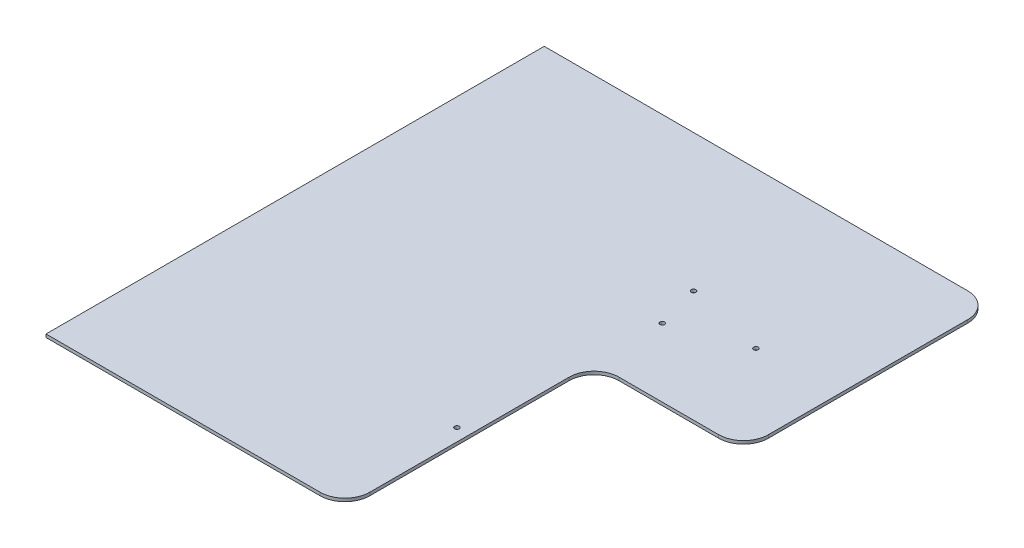
ISO-10303-21;
HEADER;
FILE_DESCRIPTION(('STEP AP214'),'2;1');
FILE_NAME('part.step','',(''),(''),'','','');
FILE_SCHEMA(('AUTOMOTIVE_DESIGN { 1 0 10303 214 1 1 1 1 }'));
ENDSEC;
DATA;
#1=APPLICATION_CONTEXT('core data for automotive mechanical design processes');
#2=APPLICATION_PROTOCOL_DEFINITION('international standard','automotive_design',2000,#1);
#3=PRODUCT_CONTEXT('',#1,'mechanical');
#4=PRODUCT('Part','Part','',(#3));
#5=PRODUCT_RELATED_PRODUCT_CATEGORY('part','',(#4));
#6=PRODUCT_DEFINITION_FORMATION('','',#4);
#7=PRODUCT_DEFINITION_CONTEXT('part definition',#1,'design');
#8=PRODUCT_DEFINITION('design','',#6,#7);
#9=PRODUCT_DEFINITION_SHAPE('','',#8);
#10=(LENGTH_UNIT() NAMED_UNIT(*) SI_UNIT(.MILLI.,.METRE.));
#11=(NAMED_UNIT(*) PLANE_ANGLE_UNIT() SI_UNIT($,.RADIAN.));
#12=(NAMED_UNIT(*) SI_UNIT($,.STERADIAN.) SOLID_ANGLE_UNIT());
#13=UNCERTAINTY_MEASURE_WITH_UNIT(LENGTH_MEASURE(1.E-05),#10,'distance_accuracy_value','');
#14=(GEOMETRIC_REPRESENTATION_CONTEXT(3) GLOBAL_UNCERTAINTY_ASSIGNED_CONTEXT((#13)) GLOBAL_UNIT_ASSIGNED_CONTEXT((#10,
#11,#12)) REPRESENTATION_CONTEXT('',''));
#15=CARTESIAN_POINT('',(0.,0.,0.));
#16=DIRECTION('',(0.,0.,1.));
#17=DIRECTION('',(1.,0.,0.));
#18=AXIS2_PLACEMENT_3D('',#15,#16,#17);
#19=CARTESIAN_POINT('',(152.4,3.175,254.));
#20=DIRECTION('',(-1.,0.,0.));
#21=DIRECTION('',(0.,0.,1.));
#22=AXIS2_PLACEMENT_3D('',#19,#20,#21);
#23=PLANE('',#22);
#24=DIRECTION('',(0.,0.,-1.));
#25=VECTOR('',#24,1.);
#26=CARTESIAN_POINT('',(152.4,3.175,254.));
#27=LINE('',#26,#25);
#28=CARTESIAN_POINT('',(152.4,3.175,228.6));
#29=VERTEX_POINT('',#28);
#30=CARTESIAN_POINT('',(152.4,3.175,25.4));
#31=VERTEX_POINT('',#30);
#32=EDGE_CURVE('E165',#29,#31,#27,.T.);
#33=ORIENTED_EDGE('',*,*,#32,.F.);
#34=DIRECTION('',(0.,-1.,0.));
#35=VECTOR('',#34,1.);
#36=CARTESIAN_POINT('',(152.4,3.175,228.6));
#37=LINE('',#36,#35);
#38=CARTESIAN_POINT('',(152.4,0.,228.6));
#39=VERTEX_POINT('',#38);
#40=EDGE_CURVE('E172',#29,#39,#37,.T.);
#41=ORIENTED_EDGE('',*,*,#40,.T.);
#42=DIRECTION('',(0.,0.,-1.));
#43=VECTOR('',#42,1.);
#44=CARTESIAN_POINT('',(152.4,0.,254.));
#45=LINE('',#44,#43);
#46=CARTESIAN_POINT('',(152.4,0.,25.4));
#47=VERTEX_POINT('',#46);
#48=EDGE_CURVE('E134',#39,#47,#45,.T.);
#49=ORIENTED_EDGE('',*,*,#48,.T.);
#50=DIRECTION('',(0.,-1.,0.));
#51=VECTOR('',#50,1.);
#52=CARTESIAN_POINT('',(152.4,3.175,25.4));
#53=LINE('',#52,#51);
#54=EDGE_CURVE('E289',#47,#31,#53,.F.);
#55=ORIENTED_EDGE('',*,*,#54,.T.);
#56=EDGE_LOOP('',(#33,#41,#49,#55));
#57=FACE_BOUND('',#56,.T.);
#58=ADVANCED_FACE('F33',(#57),#23,.F.);
#59=CARTESIAN_POINT('',(-152.4,3.175,-254.));
#60=DIRECTION('',(0.,0.,1.));
#61=DIRECTION('',(1.,0.,0.));
#62=AXIS2_PLACEMENT_3D('',#59,#60,#61);
#63=PLANE('',#62);
#64=DIRECTION('',(-1.,0.,0.));
#65=VECTOR('',#64,1.);
#66=CARTESIAN_POINT('',(-152.4,0.,-254.));
#67=LINE('',#66,#65);
#68=CARTESIAN_POINT('',(152.4,0.,-254.));
#69=VERTEX_POINT('',#68);
#70=CARTESIAN_POINT('',(-152.4,0.,-254.));
#71=VERTEX_POINT('',#70);
#72=EDGE_CURVE('E141',#69,#71,#67,.T.);
#73=ORIENTED_EDGE('',*,*,#72,.T.);
#74=DIRECTION('',(0.,-1.,0.));
#75=VECTOR('',#74,1.);
#76=CARTESIAN_POINT('',(-152.4,3.175,-254.));
#77=LINE('',#76,#75);
#78=CARTESIAN_POINT('',(-152.4,3.175,-254.));
#79=VERTEX_POINT('',#78);
#80=EDGE_CURVE('E467',#79,#71,#77,.T.);
#81=ORIENTED_EDGE('',*,*,#80,.F.);
#82=DIRECTION('',(-1.,0.,0.));
#83=VECTOR('',#82,1.);
#84=CARTESIAN_POINT('',(-152.4,3.175,-254.));
#85=LINE('',#84,#83);
#86=CARTESIAN_POINT('',(152.4,3.175,-254.));
#87=VERTEX_POINT('',#86);
#88=EDGE_CURVE('E168',#87,#79,#85,.T.);
#89=ORIENTED_EDGE('',*,*,#88,.F.);
#90=DIRECTION('',(0.,-1.,0.));
#91=VECTOR('',#90,1.);
#92=CARTESIAN_POINT('',(152.4,3.175,-254.));
#93=LINE('',#92,#91);
#94=EDGE_CURVE('E283',#87,#69,#93,.T.);
#95=ORIENTED_EDGE('',*,*,#94,.T.);
#96=EDGE_LOOP('',(#73,#81,#89,#95));
#97=FACE_BOUND('',#96,.T.);
#98=ADVANCED_FACE('F319',(#97),#63,.F.);
#99=CARTESIAN_POINT('',(-152.4,3.175,254.));
#100=DIRECTION('',(1.,0.,0.));
#101=DIRECTION('',(0.,0.,-1.));
#102=AXIS2_PLACEMENT_3D('',#99,#100,#101);
#103=PLANE('',#102);
#104=DIRECTION('',(0.,0.,1.));
#105=VECTOR('',#104,1.);
#106=CARTESIAN_POINT('',(-152.4,0.,254.));
#107=LINE('',#106,#105);
#108=CARTESIAN_POINT('',(-152.4,0.,254.));
#109=VERTEX_POINT('',#108);
#110=EDGE_CURVE('E275',#71,#109,#107,.T.);
#111=ORIENTED_EDGE('',*,*,#110,.T.);
#112=DIRECTION('',(0.,-1.,0.));
#113=VECTOR('',#112,1.);
#114=CARTESIAN_POINT('',(-152.4,3.175,254.));
#115=LINE('',#114,#113);
#116=CARTESIAN_POINT('',(-152.4,3.175,254.));
#117=VERTEX_POINT('',#116);
#118=EDGE_CURVE('E268',#117,#109,#115,.T.);
#119=ORIENTED_EDGE('',*,*,#118,.F.);
#120=DIRECTION('',(0.,0.,1.));
#121=VECTOR('',#120,1.);
#122=CARTESIAN_POINT('',(-152.4,3.175,254.));
#123=LINE('',#122,#121);
#124=EDGE_CURVE('E162',#79,#117,#123,.T.);
#125=ORIENTED_EDGE('',*,*,#124,.F.);
#126=ORIENTED_EDGE('',*,*,#80,.T.);
#127=EDGE_LOOP('',(#111,#119,#125,#126));
#128=FACE_BOUND('',#127,.T.);
#129=ADVANCED_FACE('F323',(#128),#103,.F.);
#130=CARTESIAN_POINT('',(-152.4,3.175,254.));
#131=DIRECTION('',(0.,0.,-1.));
#132=DIRECTION('',(-1.,0.,0.));
#133=AXIS2_PLACEMENT_3D('',#130,#131,#132);
#134=PLANE('',#133);
#135=DIRECTION('',(1.,0.,0.));
#136=VECTOR('',#135,1.);
#137=CARTESIAN_POINT('',(-152.4,0.,254.));
#138=LINE('',#137,#136);
#139=CARTESIAN_POINT('',(127.,0.,254.));
#140=VERTEX_POINT('',#139);
#141=EDGE_CURVE('E169',#109,#140,#138,.T.);
#142=ORIENTED_EDGE('',*,*,#141,.T.);
#143=DIRECTION('',(0.,-1.,0.));
#144=VECTOR('',#143,1.);
#145=CARTESIAN_POINT('',(127.,3.175,254.));
#146=LINE('',#145,#144);
#147=CARTESIAN_POINT('',(127.,3.175,254.));
#148=VERTEX_POINT('',#147);
#149=EDGE_CURVE('E42',#140,#148,#146,.F.);
#150=ORIENTED_EDGE('',*,*,#149,.T.);
#151=DIRECTION('',(1.,0.,0.));
#152=VECTOR('',#151,1.);
#153=CARTESIAN_POINT('',(-152.4,3.175,254.));
#154=LINE('',#153,#152);
#155=EDGE_CURVE('E262',#117,#148,#154,.T.);
#156=ORIENTED_EDGE('',*,*,#155,.F.);
#157=ORIENTED_EDGE('',*,*,#118,.T.);
#158=EDGE_LOOP('',(#142,#150,#156,#157));
#159=FACE_BOUND('',#158,.T.);
#160=ADVANCED_FACE('F259',(#159),#134,.F.);
#161=CARTESIAN_POINT('',(0.,3.175,0.));
#162=DIRECTION('',(0.,-1.,0.));
#163=DIRECTION('',(0.,0.,-1.));
#164=AXIS2_PLACEMENT_3D('',#161,#162,#163);
#165=PLANE('',#164);
#166=CARTESIAN_POINT('',(222.25,3.175,-95.0775526563993));
#167=DIRECTION('',(0.,1.,0.));
#168=DIRECTION('',(0.,0.,1.));
#169=AXIS2_PLACEMENT_3D('',#166,#167,#168);
#170=CIRCLE('',#169,2.38125);
#171=CARTESIAN_POINT('',(222.25,3.175,-92.6963026563993));
#172=VERTEX_POINT('',#171);
#173=EDGE_CURVE('E191',#172,#172,#170,.T.);
#174=ORIENTED_EDGE('',*,*,#173,.F.);
#175=EDGE_LOOP('',(#174));
#176=FACE_BOUND('',#175,.T.);
#177=CARTESIAN_POINT('',(152.4,3.175,-69.6775526563993));
#178=DIRECTION('',(0.,1.,0.));
#179=DIRECTION('',(0.,0.,1.));
#180=AXIS2_PLACEMENT_3D('',#177,#178,#179);
#181=CIRCLE('',#180,2.38125);
#182=CARTESIAN_POINT('',(152.4,3.175,-67.2963026563993));
#183=VERTEX_POINT('',#182);
#184=EDGE_CURVE('E180',#183,#183,#181,.T.);
#185=ORIENTED_EDGE('',*,*,#184,.F.);
#186=EDGE_LOOP('',(#185));
#187=FACE_BOUND('',#186,.T.);
#188=CARTESIAN_POINT('',(139.7,3.175,-114.127552656399));
#189=DIRECTION('',(0.,1.,0.));
#190=DIRECTION('',(0.,0.,1.));
#191=AXIS2_PLACEMENT_3D('',#188,#189,#190);
#192=CIRCLE('',#191,2.38125);
#193=CARTESIAN_POINT('',(139.7,3.17500000000001,-111.746302656399));
#194=VERTEX_POINT('',#193);
#195=EDGE_CURVE('E179',#194,#194,#192,.T.);
#196=ORIENTED_EDGE('',*,*,#195,.F.);
#197=EDGE_LOOP('',(#196));
#198=FACE_BOUND('',#197,.T.);
#199=CARTESIAN_POINT('',(139.7,3.175,127.172447343601));
#200=DIRECTION('',(0.,1.,0.));
#201=DIRECTION('',(0.,0.,1.));
#202=AXIS2_PLACEMENT_3D('',#199,#200,#201);
#203=CIRCLE('',#202,2.38124999999995);
#204=CARTESIAN_POINT('',(139.7,3.17500000000001,129.553697343601));
#205=VERTEX_POINT('',#204);
#206=EDGE_CURVE('E194',#205,#205,#203,.T.);
#207=ORIENTED_EDGE('',*,*,#206,.F.);
#208=EDGE_LOOP('',(#207));
#209=FACE_BOUND('',#208,.T.);
#210=ORIENTED_EDGE('',*,*,#155,.T.);
#211=CARTESIAN_POINT('',(127.,3.175,228.6));
#212=DIRECTION('',(0.,-1.,0.));
#213=DIRECTION('',(0.,0.,-1.));
#214=AXIS2_PLACEMENT_3D('',#211,#212,#213);
#215=CIRCLE('',#214,25.4);
#216=EDGE_CURVE('E11',#148,#29,#215,.F.);
#217=ORIENTED_EDGE('',*,*,#216,.T.);
#218=ORIENTED_EDGE('',*,*,#32,.T.);
#219=CARTESIAN_POINT('',(177.8,3.175,25.4));
#220=DIRECTION('',(0.,-1.,0.));
#221=DIRECTION('',(0.,0.,-1.));
#222=AXIS2_PLACEMENT_3D('',#219,#220,#221);
#223=CIRCLE('',#222,25.4);
#224=CARTESIAN_POINT('',(177.8,3.175,0.));
#225=VERTEX_POINT('',#224);
#226=EDGE_CURVE('E292',#31,#225,#223,.T.);
#227=ORIENTED_EDGE('',*,*,#226,.T.);
#228=DIRECTION('',(-1.,0.,0.));
#229=VECTOR('',#228,1.);
#230=CARTESIAN_POINT('',(304.8,3.175,0.));
#231=LINE('',#230,#229);
#232=CARTESIAN_POINT('',(279.4,3.175,0.));
#233=VERTEX_POINT('',#232);
#234=EDGE_CURVE('E206',#233,#225,#231,.T.);
#235=ORIENTED_EDGE('',*,*,#234,.F.);
#236=CARTESIAN_POINT('',(279.4,3.175,-25.4));
#237=DIRECTION('',(0.,-1.,0.));
#238=DIRECTION('',(0.,0.,-1.));
#239=AXIS2_PLACEMENT_3D('',#236,#237,#238);
#240=CIRCLE('',#239,25.4);
#241=CARTESIAN_POINT('',(304.8,3.175,-25.4));
#242=VERTEX_POINT('',#241);
#243=EDGE_CURVE('E230',#233,#242,#240,.F.);
#244=ORIENTED_EDGE('',*,*,#243,.T.);
#245=DIRECTION('',(0.,0.,1.));
#246=VECTOR('',#245,1.);
#247=CARTESIAN_POINT('',(304.8,3.175,0.));
#248=LINE('',#247,#246);
#249=CARTESIAN_POINT('',(304.8,3.175,-228.603143871149));
#250=VERTEX_POINT('',#249);
#251=EDGE_CURVE('E198',#250,#242,#248,.T.);
#252=ORIENTED_EDGE('',*,*,#251,.F.);
#253=CARTESIAN_POINT('',(279.4,3.175,-228.603143871149));
#254=DIRECTION('',(0.,-1.,0.));
#255=DIRECTION('',(0.,0.,-1.));
#256=AXIS2_PLACEMENT_3D('',#253,#254,#255);
#257=CIRCLE('',#256,25.4);
#258=CARTESIAN_POINT('',(279.4,3.175,-254.003143871149));
#259=VERTEX_POINT('',#258);
#260=EDGE_CURVE('E231',#250,#259,#257,.F.);
#261=ORIENTED_EDGE('',*,*,#260,.T.);
#262=DIRECTION('',(-1.,0.,0.));
#263=VECTOR('',#262,1.);
#264=CARTESIAN_POINT('',(304.8,3.175,-254.003143871149));
#265=LINE('',#264,#263);
#266=CARTESIAN_POINT('',(152.4,3.175,-254.003143871149));
#267=VERTEX_POINT('',#266);
#268=EDGE_CURVE('E135',#259,#267,#265,.T.);
#269=ORIENTED_EDGE('',*,*,#268,.T.);
#270=DIRECTION('',(0.,0.,1.));
#271=VECTOR('',#270,1.);
#272=CARTESIAN_POINT('',(152.4,3.175,0.));
#273=LINE('',#272,#271);
#274=EDGE_CURVE('E149',#267,#87,#273,.T.);
#275=ORIENTED_EDGE('',*,*,#274,.T.);
#276=ORIENTED_EDGE('',*,*,#88,.T.);
#277=ORIENTED_EDGE('',*,*,#124,.T.);
#278=EDGE_LOOP('',(#210,#217,#218,#227,#235,#244,#252,#261,#269,#275,#276,#277));
#279=FACE_BOUND('',#278,.T.);
#280=ADVANCED_FACE('F246',(#176,#187,#198,#209,#279),#165,.F.);
#281=CARTESIAN_POINT('',(0.,0.,0.));
#282=DIRECTION('',(0.,-1.,0.));
#283=DIRECTION('',(0.,0.,-1.));
#284=AXIS2_PLACEMENT_3D('',#281,#282,#283);
#285=PLANE('',#284);
#286=CARTESIAN_POINT('',(222.25,0.,-95.0775526563993));
#287=DIRECTION('',(0.,-1.,0.));
#288=DIRECTION('',(0.,0.,-1.));
#289=AXIS2_PLACEMENT_3D('',#286,#287,#288);
#290=CIRCLE('',#289,2.38125);
#291=CARTESIAN_POINT('',(222.25,0.,-97.4588026563993));
#292=VERTEX_POINT('',#291);
#293=EDGE_CURVE('E37',#292,#292,#290,.T.);
#294=ORIENTED_EDGE('',*,*,#293,.F.);
#295=EDGE_LOOP('',(#294));
#296=FACE_BOUND('',#295,.T.);
#297=CARTESIAN_POINT('',(152.4,0.,-69.6775526563993));
#298=DIRECTION('',(0.,-1.,0.));
#299=DIRECTION('',(0.,0.,-1.));
#300=AXIS2_PLACEMENT_3D('',#297,#298,#299);
#301=CIRCLE('',#300,2.38125);
#302=CARTESIAN_POINT('',(152.4,0.,-72.0588026563993));
#303=VERTEX_POINT('',#302);
#304=EDGE_CURVE('E177',#303,#303,#301,.T.);
#305=ORIENTED_EDGE('',*,*,#304,.F.);
#306=EDGE_LOOP('',(#305));
#307=FACE_BOUND('',#306,.T.);
#308=CARTESIAN_POINT('',(139.7,0.,-114.127552656399));
#309=DIRECTION('',(0.,-1.,0.));
#310=DIRECTION('',(0.,0.,-1.));
#311=AXIS2_PLACEMENT_3D('',#308,#309,#310);
#312=CIRCLE('',#311,2.38125);
#313=CARTESIAN_POINT('',(139.7,0.,-111.746302656399));
#314=VERTEX_POINT('',#313);
#315=EDGE_CURVE('E184',#314,#314,#312,.T.);
#316=ORIENTED_EDGE('',*,*,#315,.F.);
#317=EDGE_LOOP('',(#316));
#318=FACE_BOUND('',#317,.T.);
#319=CARTESIAN_POINT('',(139.7,0.,127.172447343601));
#320=DIRECTION('',(0.,-1.,0.));
#321=DIRECTION('',(0.,0.,-1.));
#322=AXIS2_PLACEMENT_3D('',#319,#320,#321);
#323=CIRCLE('',#322,2.38124999999995);
#324=CARTESIAN_POINT('',(139.7,0.,129.553697343601));
#325=VERTEX_POINT('',#324);
#326=EDGE_CURVE('E145',#325,#325,#323,.T.);
#327=ORIENTED_EDGE('',*,*,#326,.F.);
#328=EDGE_LOOP('',(#327));
#329=FACE_BOUND('',#328,.T.);
#330=ORIENTED_EDGE('',*,*,#48,.F.);
#331=CARTESIAN_POINT('',(127.,0.,228.6));
#332=DIRECTION('',(0.,-1.,0.));
#333=DIRECTION('',(0.,0.,-1.));
#334=AXIS2_PLACEMENT_3D('',#331,#332,#333);
#335=CIRCLE('',#334,25.4);
#336=EDGE_CURVE('E57',#39,#140,#335,.T.);
#337=ORIENTED_EDGE('',*,*,#336,.T.);
#338=ORIENTED_EDGE('',*,*,#141,.F.);
#339=ORIENTED_EDGE('',*,*,#110,.F.);
#340=ORIENTED_EDGE('',*,*,#72,.F.);
#341=DIRECTION('',(0.,0.,-1.));
#342=VECTOR('',#341,1.);
#343=CARTESIAN_POINT('',(152.4,0.,0.));
#344=LINE('',#343,#342);
#345=CARTESIAN_POINT('',(152.4,0.,-254.003143871149));
#346=VERTEX_POINT('',#345);
#347=EDGE_CURVE('E138',#69,#346,#344,.T.);
#348=ORIENTED_EDGE('',*,*,#347,.T.);
#349=DIRECTION('',(-1.,0.,0.));
#350=VECTOR('',#349,1.);
#351=CARTESIAN_POINT('',(304.8,0.,-254.003143871149));
#352=LINE('',#351,#350);
#353=CARTESIAN_POINT('',(279.4,0.,-254.003143871149));
#354=VERTEX_POINT('',#353);
#355=EDGE_CURVE('E124',#354,#346,#352,.T.);
#356=ORIENTED_EDGE('',*,*,#355,.F.);
#357=CARTESIAN_POINT('',(279.4,0.,-228.603143871149));
#358=DIRECTION('',(0.,-1.,0.));
#359=DIRECTION('',(0.,0.,-1.));
#360=AXIS2_PLACEMENT_3D('',#357,#358,#359);
#361=CIRCLE('',#360,25.4);
#362=CARTESIAN_POINT('',(304.8,0.,-228.603143871149));
#363=VERTEX_POINT('',#362);
#364=EDGE_CURVE('E233',#354,#363,#361,.T.);
#365=ORIENTED_EDGE('',*,*,#364,.T.);
#366=DIRECTION('',(0.,0.,-1.));
#367=VECTOR('',#366,1.);
#368=CARTESIAN_POINT('',(304.8,0.,0.));
#369=LINE('',#368,#367);
#370=CARTESIAN_POINT('',(304.8,0.,-25.4));
#371=VERTEX_POINT('',#370);
#372=EDGE_CURVE('E151',#371,#363,#369,.T.);
#373=ORIENTED_EDGE('',*,*,#372,.F.);
#374=CARTESIAN_POINT('',(279.4,0.,-25.4));
#375=DIRECTION('',(0.,-1.,0.));
#376=DIRECTION('',(0.,0.,-1.));
#377=AXIS2_PLACEMENT_3D('',#374,#375,#376);
#378=CIRCLE('',#377,25.4);
#379=CARTESIAN_POINT('',(279.4,0.,0.));
#380=VERTEX_POINT('',#379);
#381=EDGE_CURVE('E216',#371,#380,#378,.T.);
#382=ORIENTED_EDGE('',*,*,#381,.T.);
#383=DIRECTION('',(-1.,0.,0.));
#384=VECTOR('',#383,1.);
#385=CARTESIAN_POINT('',(304.8,0.,0.));
#386=LINE('',#385,#384);
#387=CARTESIAN_POINT('',(177.8,0.,0.));
#388=VERTEX_POINT('',#387);
#389=EDGE_CURVE('E200',#380,#388,#386,.T.);
#390=ORIENTED_EDGE('',*,*,#389,.T.);
#391=CARTESIAN_POINT('',(177.8,0.,25.4));
#392=DIRECTION('',(0.,-1.,0.));
#393=DIRECTION('',(0.,0.,-1.));
#394=AXIS2_PLACEMENT_3D('',#391,#392,#393);
#395=CIRCLE('',#394,25.4);
#396=EDGE_CURVE('E273',#388,#47,#395,.F.);
#397=ORIENTED_EDGE('',*,*,#396,.T.);
#398=EDGE_LOOP('',(#330,#337,#338,#339,#340,#348,#356,#365,#373,#382,#390,#397));
#399=FACE_BOUND('',#398,.T.);
#400=ADVANCED_FACE('F139',(#296,#307,#318,#329,#399),#285,.T.);
#401=CARTESIAN_POINT('',(304.8,0.,-254.003143871149));
#402=DIRECTION('',(0.,0.,1.));
#403=DIRECTION('',(1.,0.,0.));
#404=AXIS2_PLACEMENT_3D('',#401,#402,#403);
#405=PLANE('',#404);
#406=ORIENTED_EDGE('',*,*,#268,.F.);
#407=DIRECTION('',(0.,1.,0.));
#408=VECTOR('',#407,1.);
#409=CARTESIAN_POINT('',(279.4,0.,-254.003143871149));
#410=LINE('',#409,#408);
#411=EDGE_CURVE('E132',#259,#354,#410,.F.);
#412=ORIENTED_EDGE('',*,*,#411,.T.);
#413=ORIENTED_EDGE('',*,*,#355,.T.);
#414=DIRECTION('',(0.,1.,0.));
#415=VECTOR('',#414,1.);
#416=CARTESIAN_POINT('',(152.4,0.,-254.003143871149));
#417=LINE('',#416,#415);
#418=EDGE_CURVE('E129',#346,#267,#417,.T.);
#419=ORIENTED_EDGE('',*,*,#418,.T.);
#420=EDGE_LOOP('',(#406,#412,#413,#419));
#421=FACE_BOUND('',#420,.T.);
#422=ADVANCED_FACE('F127',(#421),#405,.F.);
#423=CARTESIAN_POINT('',(304.8,0.,0.));
#424=DIRECTION('',(0.,0.,-1.));
#425=DIRECTION('',(-1.,0.,0.));
#426=AXIS2_PLACEMENT_3D('',#423,#424,#425);
#427=PLANE('',#426);
#428=ORIENTED_EDGE('',*,*,#389,.F.);
#429=DIRECTION('',(0.,-1.,0.));
#430=VECTOR('',#429,1.);
#431=CARTESIAN_POINT('',(279.4,3.175,0.));
#432=LINE('',#431,#430);
#433=EDGE_CURVE('E175',#380,#233,#432,.F.);
#434=ORIENTED_EDGE('',*,*,#433,.T.);
#435=ORIENTED_EDGE('',*,*,#234,.T.);
#436=DIRECTION('',(0.,-1.,0.));
#437=VECTOR('',#436,1.);
#438=CARTESIAN_POINT('',(177.8,0.,0.));
#439=LINE('',#438,#437);
#440=EDGE_CURVE('E286',#225,#388,#439,.T.);
#441=ORIENTED_EDGE('',*,*,#440,.T.);
#442=EDGE_LOOP('',(#428,#434,#435,#441));
#443=FACE_BOUND('',#442,.T.);
#444=ADVANCED_FACE('F303',(#443),#427,.F.);
#445=CARTESIAN_POINT('',(304.8,0.,0.));
#446=DIRECTION('',(1.,0.,0.));
#447=DIRECTION('',(0.,0.,-1.));
#448=AXIS2_PLACEMENT_3D('',#445,#446,#447);
#449=PLANE('',#448);
#450=ORIENTED_EDGE('',*,*,#372,.T.);
#451=DIRECTION('',(0.,1.,0.));
#452=VECTOR('',#451,1.);
#453=CARTESIAN_POINT('',(304.8,3.175,-228.603143871149));
#454=LINE('',#453,#452);
#455=EDGE_CURVE('E228',#363,#250,#454,.T.);
#456=ORIENTED_EDGE('',*,*,#455,.T.);
#457=ORIENTED_EDGE('',*,*,#251,.T.);
#458=DIRECTION('',(0.,-1.,0.));
#459=VECTOR('',#458,1.);
#460=CARTESIAN_POINT('',(304.8,0.,-25.4));
#461=LINE('',#460,#459);
#462=EDGE_CURVE('E294',#242,#371,#461,.T.);
#463=ORIENTED_EDGE('',*,*,#462,.T.);
#464=EDGE_LOOP('',(#450,#456,#457,#463));
#465=FACE_BOUND('',#464,.T.);
#466=ADVANCED_FACE('F296',(#465),#449,.T.);
#467=CARTESIAN_POINT('',(152.4,0.,0.));
#468=DIRECTION('',(1.,0.,0.));
#469=DIRECTION('',(0.,0.,-1.));
#470=AXIS2_PLACEMENT_3D('',#467,#468,#469);
#471=PLANE('',#470);
#472=ORIENTED_EDGE('',*,*,#94,.F.);
#473=ORIENTED_EDGE('',*,*,#274,.F.);
#474=ORIENTED_EDGE('',*,*,#418,.F.);
#475=ORIENTED_EDGE('',*,*,#347,.F.);
#476=EDGE_LOOP('',(#472,#473,#474,#475));
#477=FACE_BOUND('',#476,.T.);
#478=ADVANCED_FACE('F147',(#477),#471,.F.);
#479=CARTESIAN_POINT('',(177.8,0.,25.4));
#480=DIRECTION('',(0.,1.,0.));
#481=DIRECTION('',(0.,0.,1.));
#482=AXIS2_PLACEMENT_3D('',#479,#480,#481);
#483=CYLINDRICAL_SURFACE('',#482,25.4);
#484=ORIENTED_EDGE('',*,*,#226,.F.);
#485=ORIENTED_EDGE('',*,*,#54,.F.);
#486=ORIENTED_EDGE('',*,*,#396,.F.);
#487=ORIENTED_EDGE('',*,*,#440,.F.);
#488=EDGE_LOOP('',(#484,#485,#486,#487));
#489=FACE_BOUND('',#488,.T.);
#490=ADVANCED_FACE('F307',(#489),#483,.F.);
#491=CARTESIAN_POINT('',(279.4,0.,-228.603143871149));
#492=DIRECTION('',(0.,-1.,0.));
#493=DIRECTION('',(0.,0.,-1.));
#494=AXIS2_PLACEMENT_3D('',#491,#492,#493);
#495=CYLINDRICAL_SURFACE('',#494,25.4);
#496=ORIENTED_EDGE('',*,*,#364,.F.);
#497=ORIENTED_EDGE('',*,*,#411,.F.);
#498=ORIENTED_EDGE('',*,*,#260,.F.);
#499=ORIENTED_EDGE('',*,*,#455,.F.);
#500=EDGE_LOOP('',(#496,#497,#498,#499));
#501=FACE_BOUND('',#500,.T.);
#502=ADVANCED_FACE('F309',(#501),#495,.T.);
#503=CARTESIAN_POINT('',(279.4,0.,-25.4));
#504=DIRECTION('',(0.,1.,0.));
#505=DIRECTION('',(0.,0.,1.));
#506=AXIS2_PLACEMENT_3D('',#503,#504,#505);
#507=CYLINDRICAL_SURFACE('',#506,25.4);
#508=ORIENTED_EDGE('',*,*,#243,.F.);
#509=ORIENTED_EDGE('',*,*,#433,.F.);
#510=ORIENTED_EDGE('',*,*,#381,.F.);
#511=ORIENTED_EDGE('',*,*,#462,.F.);
#512=EDGE_LOOP('',(#508,#509,#510,#511));
#513=FACE_BOUND('',#512,.T.);
#514=ADVANCED_FACE('F254',(#513),#507,.T.);
#515=CARTESIAN_POINT('',(139.7,-149.225,127.172447343601));
#516=DIRECTION('',(0.,1.,0.));
#517=DIRECTION('',(0.,0.,1.));
#518=AXIS2_PLACEMENT_3D('',#515,#516,#517);
#519=CYLINDRICAL_SURFACE('',#518,2.38124999999995);
#520=CARTESIAN_POINT('',(139.7,0.,129.553697343601));
#521=CARTESIAN_POINT('',(139.7,0.0330729166666914,129.553697343601));
#522=CARTESIAN_POINT('',(139.7,0.066145833333355,129.553697343601));
#523=CARTESIAN_POINT('',(139.7,0.132291666666691,129.553697343601));
#524=CARTESIAN_POINT('',(139.7,0.165364583333364,129.553697343601));
#525=CARTESIAN_POINT('',(139.7,0.231510416666701,129.553697343601));
#526=CARTESIAN_POINT('',(139.7,0.264583333333364,129.553697343601));
#527=CARTESIAN_POINT('',(139.7,0.330729166666692,129.553697343601));
#528=CARTESIAN_POINT('',(139.7,0.363802083333355,129.553697343601));
#529=CARTESIAN_POINT('',(139.7,0.429947916666692,129.553697343601));
#530=CARTESIAN_POINT('',(139.7,0.463020833333364,129.553697343601));
#531=CARTESIAN_POINT('',(139.7,0.529166666666701,129.553697343601));
#532=CARTESIAN_POINT('',(139.7,0.562239583333365,129.553697343601));
#533=CARTESIAN_POINT('',(139.7,0.628385416666692,129.553697343601));
#534=CARTESIAN_POINT('',(139.7,0.661458333333355,129.553697343601));
#535=CARTESIAN_POINT('',(139.7,0.727604166666682,129.553697343601));
#536=CARTESIAN_POINT('',(139.7,0.760677083333346,129.553697343601));
#537=CARTESIAN_POINT('',(139.7,0.826822916666683,129.553697343601));
#538=CARTESIAN_POINT('',(139.7,0.859895833333355,129.553697343601));
#539=CARTESIAN_POINT('',(139.7,0.926041666666692,129.553697343601));
#540=CARTESIAN_POINT('',(139.7,0.959114583333356,129.553697343601));
#541=CARTESIAN_POINT('',(139.7,1.02526041666668,129.553697343601));
#542=CARTESIAN_POINT('',(139.7,1.05833333333335,129.553697343601));
#543=CARTESIAN_POINT('',(139.7,1.12447916666668,129.553697343601));
#544=CARTESIAN_POINT('',(139.7,1.15755208333336,129.553697343601));
#545=CARTESIAN_POINT('',(139.7,1.22369791666669,129.553697343601));
#546=CARTESIAN_POINT('',(139.7,1.25677083333336,129.553697343601));
#547=CARTESIAN_POINT('',(139.7,1.32291666666668,129.553697343601));
#548=CARTESIAN_POINT('',(139.7,1.35598958333335,129.553697343601));
#549=CARTESIAN_POINT('',(139.7,1.42213541666668,129.553697343601));
#550=CARTESIAN_POINT('',(139.7,1.45520833333336,129.553697343601));
#551=CARTESIAN_POINT('',(139.7,1.52135416666669,129.553697343601));
#552=CARTESIAN_POINT('',(139.7,1.55442708333336,129.553697343601));
#553=CARTESIAN_POINT('',(139.7,1.62057291666668,129.553697343601));
#554=CARTESIAN_POINT('',(139.7,1.65364583333335,129.553697343601));
#555=CARTESIAN_POINT('',(139.7,1.71979166666668,129.553697343601));
#556=CARTESIAN_POINT('',(139.7,1.75286458333336,129.553697343601));
#557=CARTESIAN_POINT('',(139.7,1.81901041666669,129.553697343601));
#558=CARTESIAN_POINT('',(139.7,1.85208333333336,129.553697343601));
#559=CARTESIAN_POINT('',(139.7,1.91822916666668,129.553697343601));
#560=CARTESIAN_POINT('',(139.7,1.95130208333335,129.553697343601));
#561=CARTESIAN_POINT('',(139.7,2.01744791666668,129.553697343601));
#562=CARTESIAN_POINT('',(139.7,2.05052083333336,129.553697343601));
#563=CARTESIAN_POINT('',(139.7,2.11666666666669,129.553697343601));
#564=CARTESIAN_POINT('',(139.7,2.14973958333336,129.553697343601));
#565=CARTESIAN_POINT('',(139.7,2.21588541666668,129.553697343601));
#566=CARTESIAN_POINT('',(139.7,2.24895833333335,129.553697343601));
#567=CARTESIAN_POINT('',(139.7,2.31510416666668,129.553697343601));
#568=CARTESIAN_POINT('',(139.7,2.34817708333336,129.553697343601));
#569=CARTESIAN_POINT('',(139.7,2.41432291666669,129.553697343601));
#570=CARTESIAN_POINT('',(139.7,2.44739583333336,129.553697343601));
#571=CARTESIAN_POINT('',(139.7,2.51354166666668,129.553697343601));
#572=CARTESIAN_POINT('',(139.7,2.54661458333335,129.553697343601));
#573=CARTESIAN_POINT('',(139.7,2.61276041666667,129.553697343601));
#574=CARTESIAN_POINT('',(139.7,2.64583333333334,129.553697343601));
#575=CARTESIAN_POINT('',(139.7,2.71197916666667,129.553697343601));
#576=CARTESIAN_POINT('',(139.7,2.74505208333335,129.553697343601));
#577=CARTESIAN_POINT('',(139.7,2.81119791666668,129.553697343601));
#578=CARTESIAN_POINT('',(139.7,2.84427083333335,129.553697343601));
#579=CARTESIAN_POINT('',(139.7,2.91041666666667,129.553697343601));
#580=CARTESIAN_POINT('',(139.7,2.94348958333334,129.553697343601));
#581=CARTESIAN_POINT('',(139.7,3.00963541666667,129.553697343601));
#582=CARTESIAN_POINT('',(139.7,3.04270833333335,129.553697343601));
#583=CARTESIAN_POINT('',(139.7,3.10885416666668,129.553697343601));
#584=CARTESIAN_POINT('',(139.7,3.14192708333335,129.553697343601));
#585=CARTESIAN_POINT('',(139.7,3.17500000000001,129.553697343601));
#586=B_SPLINE_CURVE_WITH_KNOTS('',3,(#520,#521,#522,#523,#524,#525,#526,#527,#528,#529,#530,
#531,#532,#533,#534,#535,#536,#537,#538,#539,#540,#541,#542,#543,#544,#545,#546,#547,#548,#549,
#550,#551,#552,#553,#554,#555,#556,#557,#558,#559,#560,#561,#562,#563,#564,#565,#566,#567,#568,
#569,#570,#571,#572,#573,#574,#575,#576,#577,#578,#579,#580,#581,#582,#583,#584,#585),
.UNSPECIFIED.,.F.,.F.,(4,2,2,2,2,2,2,2,2,2,2,2,2,2,2,2,2,2,2,2,2,2,2,2,2,2,2,2,2,2,2,2,4),(0.,
0.0992187499999908,0.198437500000009,0.29765625,0.396874999999991,0.49609375000001,0.5953125,
0.694531249999991,0.793749999999982,0.892968750000001,0.992187499999991,1.09140624999998,
1.190625,1.28984374999999,1.38906249999998,1.48828125,1.58749999999999,1.68671874999998,
1.7859375,1.88515624999999,1.98437499999998,2.08359375,2.18281249999999,2.28203124999998,
2.38125,2.48046874999999,2.57968749999998,2.67890624999997,2.77812499999999,2.87734374999998,
2.97656249999997,3.07578124999999,3.17499999999998),.UNSPECIFIED.);
#587=EDGE_CURVE('BSEAM251',#325,#205,#586,.T.);
#588=ORIENTED_EDGE('',*,*,#326,.T.);
#589=ORIENTED_EDGE('',*,*,#206,.T.);
#590=ORIENTED_EDGE('',*,*,#587,.T.);
#591=ORIENTED_EDGE('',*,*,#587,.F.);
#592=EDGE_LOOP('',(#588,#590,#589,#591));
#593=FACE_BOUND('',#592,.T.);
#594=ADVANCED_FACE('F251',(#593),#519,.F.);
#595=CARTESIAN_POINT('',(139.7,-149.225,-114.127552656399));
#596=DIRECTION('',(0.,1.,0.));
#597=DIRECTION('',(0.,0.,1.));
#598=AXIS2_PLACEMENT_3D('',#595,#596,#597);
#599=CYLINDRICAL_SURFACE('',#598,2.38125);
#600=CARTESIAN_POINT('',(139.7,0.,-111.746302656399));
#601=CARTESIAN_POINT('',(139.7,0.0330729166666914,-111.746302656399));
#602=CARTESIAN_POINT('',(139.7,0.066145833333355,-111.746302656399));
#603=CARTESIAN_POINT('',(139.7,0.132291666666691,-111.746302656399));
#604=CARTESIAN_POINT('',(139.7,0.165364583333364,-111.746302656399));
#605=CARTESIAN_POINT('',(139.7,0.231510416666701,-111.746302656399));
#606=CARTESIAN_POINT('',(139.7,0.264583333333364,-111.746302656399));
#607=CARTESIAN_POINT('',(139.7,0.330729166666692,-111.746302656399));
#608=CARTESIAN_POINT('',(139.7,0.363802083333355,-111.746302656399));
#609=CARTESIAN_POINT('',(139.7,0.429947916666692,-111.746302656399));
#610=CARTESIAN_POINT('',(139.7,0.463020833333364,-111.746302656399));
#611=CARTESIAN_POINT('',(139.7,0.529166666666701,-111.746302656399));
#612=CARTESIAN_POINT('',(139.7,0.562239583333365,-111.746302656399));
#613=CARTESIAN_POINT('',(139.7,0.628385416666692,-111.746302656399));
#614=CARTESIAN_POINT('',(139.7,0.661458333333355,-111.746302656399));
#615=CARTESIAN_POINT('',(139.7,0.727604166666682,-111.746302656399));
#616=CARTESIAN_POINT('',(139.7,0.760677083333346,-111.746302656399));
#617=CARTESIAN_POINT('',(139.7,0.826822916666683,-111.746302656399));
#618=CARTESIAN_POINT('',(139.7,0.859895833333355,-111.746302656399));
#619=CARTESIAN_POINT('',(139.7,0.926041666666692,-111.746302656399));
#620=CARTESIAN_POINT('',(139.7,0.959114583333356,-111.746302656399));
#621=CARTESIAN_POINT('',(139.7,1.02526041666668,-111.746302656399));
#622=CARTESIAN_POINT('',(139.7,1.05833333333335,-111.746302656399));
#623=CARTESIAN_POINT('',(139.7,1.12447916666668,-111.746302656399));
#624=CARTESIAN_POINT('',(139.7,1.15755208333336,-111.746302656399));
#625=CARTESIAN_POINT('',(139.7,1.22369791666669,-111.746302656399));
#626=CARTESIAN_POINT('',(139.7,1.25677083333336,-111.746302656399));
#627=CARTESIAN_POINT('',(139.7,1.32291666666668,-111.746302656399));
#628=CARTESIAN_POINT('',(139.7,1.35598958333335,-111.746302656399));
#629=CARTESIAN_POINT('',(139.7,1.42213541666668,-111.746302656399));
#630=CARTESIAN_POINT('',(139.7,1.45520833333336,-111.746302656399));
#631=CARTESIAN_POINT('',(139.7,1.52135416666669,-111.746302656399));
#632=CARTESIAN_POINT('',(139.7,1.55442708333336,-111.746302656399));
#633=CARTESIAN_POINT('',(139.7,1.62057291666668,-111.746302656399));
#634=CARTESIAN_POINT('',(139.7,1.65364583333335,-111.746302656399));
#635=CARTESIAN_POINT('',(139.7,1.71979166666668,-111.746302656399));
#636=CARTESIAN_POINT('',(139.7,1.75286458333336,-111.746302656399));
#637=CARTESIAN_POINT('',(139.7,1.81901041666669,-111.746302656399));
#638=CARTESIAN_POINT('',(139.7,1.85208333333336,-111.746302656399));
#639=CARTESIAN_POINT('',(139.7,1.91822916666668,-111.746302656399));
#640=CARTESIAN_POINT('',(139.7,1.95130208333335,-111.746302656399));
#641=CARTESIAN_POINT('',(139.7,2.01744791666668,-111.746302656399));
#642=CARTESIAN_POINT('',(139.7,2.05052083333336,-111.746302656399));
#643=CARTESIAN_POINT('',(139.7,2.11666666666669,-111.746302656399));
#644=CARTESIAN_POINT('',(139.7,2.14973958333336,-111.746302656399));
#645=CARTESIAN_POINT('',(139.7,2.21588541666668,-111.746302656399));
#646=CARTESIAN_POINT('',(139.7,2.24895833333335,-111.746302656399));
#647=CARTESIAN_POINT('',(139.7,2.31510416666668,-111.746302656399));
#648=CARTESIAN_POINT('',(139.7,2.34817708333336,-111.746302656399));
#649=CARTESIAN_POINT('',(139.7,2.41432291666669,-111.746302656399));
#650=CARTESIAN_POINT('',(139.7,2.44739583333336,-111.746302656399));
#651=CARTESIAN_POINT('',(139.7,2.51354166666668,-111.746302656399));
#652=CARTESIAN_POINT('',(139.7,2.54661458333335,-111.746302656399));
#653=CARTESIAN_POINT('',(139.7,2.61276041666667,-111.746302656399));
#654=CARTESIAN_POINT('',(139.7,2.64583333333334,-111.746302656399));
#655=CARTESIAN_POINT('',(139.7,2.71197916666667,-111.746302656399));
#656=CARTESIAN_POINT('',(139.7,2.74505208333335,-111.746302656399));
#657=CARTESIAN_POINT('',(139.7,2.81119791666668,-111.746302656399));
#658=CARTESIAN_POINT('',(139.7,2.84427083333335,-111.746302656399));
#659=CARTESIAN_POINT('',(139.7,2.91041666666667,-111.746302656399));
#660=CARTESIAN_POINT('',(139.7,2.94348958333334,-111.746302656399));
#661=CARTESIAN_POINT('',(139.7,3.00963541666667,-111.746302656399));
#662=CARTESIAN_POINT('',(139.7,3.04270833333335,-111.746302656399));
#663=CARTESIAN_POINT('',(139.7,3.10885416666668,-111.746302656399));
#664=CARTESIAN_POINT('',(139.7,3.14192708333335,-111.746302656399));
#665=CARTESIAN_POINT('',(139.7,3.17500000000001,-111.746302656399));
#666=B_SPLINE_CURVE_WITH_KNOTS('',3,(#600,#601,#602,#603,#604,#605,#606,#607,#608,#609,#610,
#611,#612,#613,#614,#615,#616,#617,#618,#619,#620,#621,#622,#623,#624,#625,#626,#627,#628,#629,
#630,#631,#632,#633,#634,#635,#636,#637,#638,#639,#640,#641,#642,#643,#644,#645,#646,#647,#648,
#649,#650,#651,#652,#653,#654,#655,#656,#657,#658,#659,#660,#661,#662,#663,#664,#665),
.UNSPECIFIED.,.F.,.F.,(4,2,2,2,2,2,2,2,2,2,2,2,2,2,2,2,2,2,2,2,2,2,2,2,2,2,2,2,2,2,2,2,4),(0.,
0.0992187499999908,0.198437500000009,0.29765625,0.396874999999991,0.49609375000001,0.5953125,
0.694531249999991,0.793749999999982,0.892968750000001,0.992187499999991,1.09140624999998,
1.190625,1.28984374999999,1.38906249999998,1.48828125,1.58749999999999,1.68671874999998,
1.7859375,1.88515624999999,1.98437499999998,2.08359375,2.18281249999999,2.28203124999998,
2.38125,2.48046874999999,2.57968749999998,2.67890624999997,2.77812499999999,2.87734374999998,
2.97656249999997,3.07578124999999,3.17499999999998),.UNSPECIFIED.);
#667=EDGE_CURVE('BSEAM241',#314,#194,#666,.T.);
#668=ORIENTED_EDGE('',*,*,#315,.T.);
#669=ORIENTED_EDGE('',*,*,#195,.T.);
#670=ORIENTED_EDGE('',*,*,#667,.T.);
#671=ORIENTED_EDGE('',*,*,#667,.F.);
#672=EDGE_LOOP('',(#668,#670,#669,#671));
#673=FACE_BOUND('',#672,.T.);
#674=ADVANCED_FACE('F241',(#673),#599,.F.);
#675=CARTESIAN_POINT('',(127.,3.175,228.6));
#676=DIRECTION('',(0.,-1.,0.));
#677=DIRECTION('',(0.,0.,-1.));
#678=AXIS2_PLACEMENT_3D('',#675,#676,#677);
#679=CYLINDRICAL_SURFACE('',#678,25.4);
#680=ORIENTED_EDGE('',*,*,#216,.F.);
#681=ORIENTED_EDGE('',*,*,#149,.F.);
#682=ORIENTED_EDGE('',*,*,#336,.F.);
#683=ORIENTED_EDGE('',*,*,#40,.F.);
#684=EDGE_LOOP('',(#680,#681,#682,#683));
#685=FACE_BOUND('',#684,.T.);
#686=ADVANCED_FACE('F35',(#685),#679,.T.);
#687=CARTESIAN_POINT('',(152.4,-5.00000000001367E-05,-69.6775526563993));
#688=DIRECTION('',(0.,1.,0.));
#689=DIRECTION('',(0.,0.,1.));
#690=AXIS2_PLACEMENT_3D('',#687,#688,#689);
#691=CYLINDRICAL_SURFACE('',#690,2.38125);
#692=ORIENTED_EDGE('',*,*,#304,.T.);
#693=EDGE_LOOP('',(#692));
#694=FACE_BOUND('',#693,.T.);
#695=ORIENTED_EDGE('',*,*,#184,.T.);
#696=EDGE_LOOP('',(#695));
#697=FACE_BOUND('',#696,.T.);
#698=ADVANCED_FACE('F339',(#694,#697),#691,.F.);
#699=CARTESIAN_POINT('',(222.25,-5.00000000001367E-05,-95.0775526563993));
#700=DIRECTION('',(0.,1.,0.));
#701=DIRECTION('',(0.,0.,1.));
#702=AXIS2_PLACEMENT_3D('',#699,#700,#701);
#703=CYLINDRICAL_SURFACE('',#702,2.38125);
#704=ORIENTED_EDGE('',*,*,#293,.T.);
#705=EDGE_LOOP('',(#704));
#706=FACE_BOUND('',#705,.T.);
#707=ORIENTED_EDGE('',*,*,#173,.T.);
#708=EDGE_LOOP('',(#707));
#709=FACE_BOUND('',#708,.T.);
#710=ADVANCED_FACE('F342',(#706,#709),#703,.F.);
#711=CLOSED_SHELL('',(#58,#98,#129,#160,#280,#400,#422,#444,#466,#478,#490,#502,#514,#594,#674,
#686,#698,#710));
#712=MANIFOLD_SOLID_BREP('B2',#711);
#713=ADVANCED_BREP_SHAPE_REPRESENTATION('',(#18,#712),#14);
#714=SHAPE_DEFINITION_REPRESENTATION(#9,#713);
ENDSEC;
END-ISO-10303-21;
